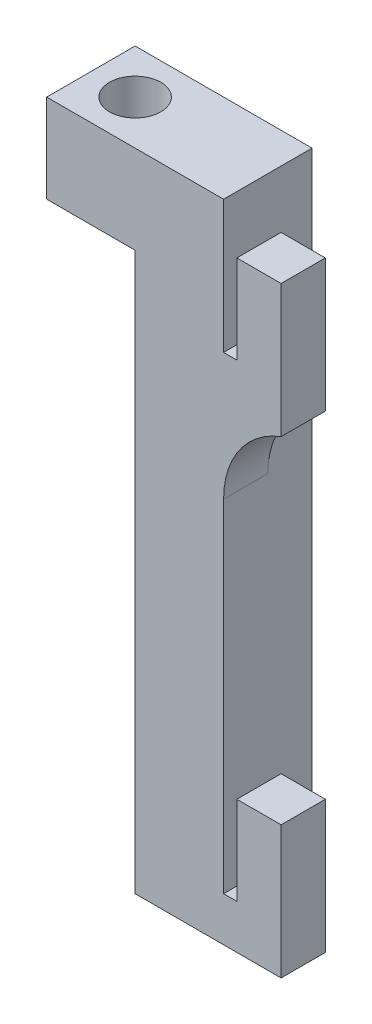
ISO-10303-21;
HEADER;
FILE_DESCRIPTION(('STEP AP214'),'2;1');
FILE_NAME('part.step','',(''),(''),'','','');
FILE_SCHEMA(('AUTOMOTIVE_DESIGN { 1 0 10303 214 1 1 1 1 }'));
ENDSEC;
DATA;
#1=APPLICATION_CONTEXT('core data for automotive mechanical design processes');
#2=APPLICATION_PROTOCOL_DEFINITION('international standard','automotive_design',2000,#1);
#3=PRODUCT_CONTEXT('',#1,'mechanical');
#4=PRODUCT('Part','Part','',(#3));
#5=PRODUCT_RELATED_PRODUCT_CATEGORY('part','',(#4));
#6=PRODUCT_DEFINITION_FORMATION('','',#4);
#7=PRODUCT_DEFINITION_CONTEXT('part definition',#1,'design');
#8=PRODUCT_DEFINITION('design','',#6,#7);
#9=PRODUCT_DEFINITION_SHAPE('','',#8);
#10=(LENGTH_UNIT() NAMED_UNIT(*) SI_UNIT(.MILLI.,.METRE.));
#11=(NAMED_UNIT(*) PLANE_ANGLE_UNIT() SI_UNIT($,.RADIAN.));
#12=(NAMED_UNIT(*) SI_UNIT($,.STERADIAN.) SOLID_ANGLE_UNIT());
#13=UNCERTAINTY_MEASURE_WITH_UNIT(LENGTH_MEASURE(1.E-05),#10,'distance_accuracy_value','');
#14=(GEOMETRIC_REPRESENTATION_CONTEXT(3) GLOBAL_UNCERTAINTY_ASSIGNED_CONTEXT((#13)) GLOBAL_UNIT_ASSIGNED_CONTEXT((#10,
#11,#12)) REPRESENTATION_CONTEXT('',''));
#15=CARTESIAN_POINT('',(0.,0.,0.));
#16=DIRECTION('',(0.,0.,1.));
#17=DIRECTION('',(1.,0.,0.));
#18=AXIS2_PLACEMENT_3D('',#15,#16,#17);
#19=CARTESIAN_POINT('',(0.,10.,-15.));
#20=DIRECTION('',(1.,0.,0.));
#21=DIRECTION('',(0.,1.,0.));
#22=AXIS2_PLACEMENT_3D('',#19,#20,#21);
#23=PLANE('',#22);
#24=DIRECTION('',(0.,-1.,0.));
#25=VECTOR('',#24,1.);
#26=CARTESIAN_POINT('',(0.,10.,-5.));
#27=LINE('',#26,#25);
#28=CARTESIAN_POINT('',(0.,10.,-5.));
#29=VERTEX_POINT('',#28);
#30=CARTESIAN_POINT('',(0.,0.,-5.));
#31=VERTEX_POINT('',#30);
#32=EDGE_CURVE('E219',#29,#31,#27,.T.);
#33=ORIENTED_EDGE('',*,*,#32,.F.);
#34=DIRECTION('',(0.,0.,1.));
#35=VECTOR('',#34,1.);
#36=CARTESIAN_POINT('',(0.,10.,-15.));
#37=LINE('',#36,#35);
#38=CARTESIAN_POINT('',(0.,10.,-15.));
#39=VERTEX_POINT('',#38);
#40=EDGE_CURVE('E218',#39,#29,#37,.T.);
#41=ORIENTED_EDGE('',*,*,#40,.F.);
#42=DIRECTION('',(0.,-1.,0.));
#43=VECTOR('',#42,1.);
#44=CARTESIAN_POINT('',(0.,10.,-15.));
#45=LINE('',#44,#43);
#46=CARTESIAN_POINT('',(0.,0.,-15.));
#47=VERTEX_POINT('',#46);
#48=EDGE_CURVE('E272',#39,#47,#45,.T.);
#49=ORIENTED_EDGE('',*,*,#48,.T.);
#50=DIRECTION('',(0.,0.,1.));
#51=VECTOR('',#50,1.);
#52=CARTESIAN_POINT('',(0.,0.,-15.));
#53=LINE('',#52,#51);
#54=EDGE_CURVE('E319',#47,#31,#53,.T.);
#55=ORIENTED_EDGE('',*,*,#54,.T.);
#56=EDGE_LOOP('',(#33,#41,#49,#55));
#57=FACE_BOUND('',#56,.T.);
#58=ADVANCED_FACE('F44',(#57),#23,.F.);
#59=CARTESIAN_POINT('',(0.,0.,-15.));
#60=DIRECTION('',(0.,1.,0.));
#61=DIRECTION('',(0.,0.,-1.));
#62=AXIS2_PLACEMENT_3D('',#59,#60,#61);
#63=PLANE('',#62);
#64=CARTESIAN_POINT('',(5.,0.,-10.));
#65=DIRECTION('',(0.,-1.,0.));
#66=DIRECTION('',(0.,0.,-1.));
#67=AXIS2_PLACEMENT_3D('',#64,#65,#66);
#68=CIRCLE('',#67,2.89999999999999);
#69=CARTESIAN_POINT('',(5.,0.,-12.9));
#70=VERTEX_POINT('',#69);
#71=EDGE_CURVE('E327',#70,#70,#68,.T.);
#72=ORIENTED_EDGE('',*,*,#71,.F.);
#73=EDGE_LOOP('',(#72));
#74=FACE_BOUND('',#73,.T.);
#75=DIRECTION('',(1.,0.,0.));
#76=VECTOR('',#75,1.);
#77=CARTESIAN_POINT('',(0.,0.,-5.));
#78=LINE('',#77,#76);
#79=CARTESIAN_POINT('',(10.,0.,-5.));
#80=VERTEX_POINT('',#79);
#81=EDGE_CURVE('E224',#31,#80,#78,.T.);
#82=ORIENTED_EDGE('',*,*,#81,.F.);
#83=ORIENTED_EDGE('',*,*,#54,.F.);
#84=DIRECTION('',(1.,0.,0.));
#85=VECTOR('',#84,1.);
#86=CARTESIAN_POINT('',(0.,0.,-15.));
#87=LINE('',#86,#85);
#88=CARTESIAN_POINT('',(10.,0.,-15.));
#89=VERTEX_POINT('',#88);
#90=EDGE_CURVE('E212',#47,#89,#87,.T.);
#91=ORIENTED_EDGE('',*,*,#90,.T.);
#92=DIRECTION('',(0.,0.,1.));
#93=VECTOR('',#92,1.);
#94=CARTESIAN_POINT('',(10.,0.,-15.));
#95=LINE('',#94,#93);
#96=EDGE_CURVE('E320',#89,#80,#95,.T.);
#97=ORIENTED_EDGE('',*,*,#96,.T.);
#98=EDGE_LOOP('',(#82,#83,#91,#97));
#99=FACE_BOUND('',#98,.T.);
#100=ADVANCED_FACE('F358',(#74,#99),#63,.F.);
#101=CARTESIAN_POINT('',(10.,0.,-15.));
#102=DIRECTION('',(1.,0.,0.));
#103=DIRECTION('',(0.,1.,0.));
#104=AXIS2_PLACEMENT_3D('',#101,#102,#103);
#105=PLANE('',#104);
#106=DIRECTION('',(0.,-1.,0.));
#107=VECTOR('',#106,1.);
#108=CARTESIAN_POINT('',(10.,0.,-5.));
#109=LINE('',#108,#107);
#110=CARTESIAN_POINT('',(10.,-63.,-5.));
#111=VERTEX_POINT('',#110);
#112=EDGE_CURVE('E230',#80,#111,#109,.T.);
#113=ORIENTED_EDGE('',*,*,#112,.F.);
#114=ORIENTED_EDGE('',*,*,#96,.F.);
#115=DIRECTION('',(0.,-1.,0.));
#116=VECTOR('',#115,1.);
#117=CARTESIAN_POINT('',(10.,0.,-15.));
#118=LINE('',#117,#116);
#119=CARTESIAN_POINT('',(10.,-63.,-15.));
#120=VERTEX_POINT('',#119);
#121=EDGE_CURVE('E209',#89,#120,#118,.T.);
#122=ORIENTED_EDGE('',*,*,#121,.T.);
#123=DIRECTION('',(0.,0.,1.));
#124=VECTOR('',#123,1.);
#125=CARTESIAN_POINT('',(10.,-63.,-15.));
#126=LINE('',#125,#124);
#127=EDGE_CURVE('E210',#120,#111,#126,.T.);
#128=ORIENTED_EDGE('',*,*,#127,.T.);
#129=EDGE_LOOP('',(#113,#114,#122,#128));
#130=FACE_BOUND('',#129,.T.);
#131=ADVANCED_FACE('F365',(#130),#105,.F.);
#132=CARTESIAN_POINT('',(10.,-63.,-15.));
#133=DIRECTION('',(0.,1.,0.));
#134=DIRECTION('',(0.,0.,-1.));
#135=AXIS2_PLACEMENT_3D('',#132,#133,#134);
#136=PLANE('',#135);
#137=DIRECTION('',(-1.,0.,0.));
#138=VECTOR('',#137,1.);
#139=CARTESIAN_POINT('',(20.,-63.,-10.));
#140=LINE('',#139,#138);
#141=CARTESIAN_POINT('',(26.5,-63.,-10.));
#142=VERTEX_POINT('',#141);
#143=CARTESIAN_POINT('',(20.,-63.,-10.));
#144=VERTEX_POINT('',#143);
#145=EDGE_CURVE('E205',#142,#144,#140,.T.);
#146=ORIENTED_EDGE('',*,*,#145,.F.);
#147=DIRECTION('',(0.,0.,1.));
#148=VECTOR('',#147,1.);
#149=CARTESIAN_POINT('',(26.5,-63.,-15.));
#150=LINE('',#149,#148);
#151=CARTESIAN_POINT('',(26.5,-63.,-5.));
#152=VERTEX_POINT('',#151);
#153=EDGE_CURVE('E315',#142,#152,#150,.T.);
#154=ORIENTED_EDGE('',*,*,#153,.T.);
#155=DIRECTION('',(1.,0.,0.));
#156=VECTOR('',#155,1.);
#157=CARTESIAN_POINT('',(10.,-63.,-5.));
#158=LINE('',#157,#156);
#159=EDGE_CURVE('E232',#111,#152,#158,.T.);
#160=ORIENTED_EDGE('',*,*,#159,.F.);
#161=ORIENTED_EDGE('',*,*,#127,.F.);
#162=DIRECTION('',(1.,0.,0.));
#163=VECTOR('',#162,1.);
#164=CARTESIAN_POINT('',(10.,-63.,-15.));
#165=LINE('',#164,#163);
#166=CARTESIAN_POINT('',(20.,-63.,-15.));
#167=VERTEX_POINT('',#166);
#168=EDGE_CURVE('E184',#120,#167,#165,.T.);
#169=ORIENTED_EDGE('',*,*,#168,.T.);
#170=DIRECTION('',(0.,0.,-1.));
#171=VECTOR('',#170,1.);
#172=CARTESIAN_POINT('',(20.,-63.,-15.));
#173=LINE('',#172,#171);
#174=EDGE_CURVE('E191',#144,#167,#173,.T.);
#175=ORIENTED_EDGE('',*,*,#174,.F.);
#176=EDGE_LOOP('',(#146,#154,#160,#161,#169,#175));
#177=FACE_BOUND('',#176,.T.);
#178=ADVANCED_FACE('F202',(#177),#136,.F.);
#179=CARTESIAN_POINT('',(26.5,-63.,-15.));
#180=DIRECTION('',(-1.,0.,0.));
#181=DIRECTION('',(0.,0.,-1.));
#182=AXIS2_PLACEMENT_3D('',#179,#180,#181);
#183=PLANE('',#182);
#184=DIRECTION('',(0.,0.,1.));
#185=VECTOR('',#184,1.);
#186=CARTESIAN_POINT('',(26.5,-48.,-15.));
#187=LINE('',#186,#185);
#188=CARTESIAN_POINT('',(26.5,-48.,-10.));
#189=VERTEX_POINT('',#188);
#190=CARTESIAN_POINT('',(26.5,-48.,-5.));
#191=VERTEX_POINT('',#190);
#192=EDGE_CURVE('E306',#189,#191,#187,.T.);
#193=ORIENTED_EDGE('',*,*,#192,.T.);
#194=DIRECTION('',(0.,1.,0.));
#195=VECTOR('',#194,1.);
#196=CARTESIAN_POINT('',(26.5,-63.,-5.));
#197=LINE('',#196,#195);
#198=EDGE_CURVE('E233',#152,#191,#197,.T.);
#199=ORIENTED_EDGE('',*,*,#198,.F.);
#200=ORIENTED_EDGE('',*,*,#153,.F.);
#201=DIRECTION('',(0.,1.,0.));
#202=VECTOR('',#201,1.);
#203=CARTESIAN_POINT('',(26.5,-63.,-10.));
#204=LINE('',#203,#202);
#205=EDGE_CURVE('E335',#142,#189,#204,.T.);
#206=ORIENTED_EDGE('',*,*,#205,.T.);
#207=EDGE_LOOP('',(#193,#199,#200,#206));
#208=FACE_BOUND('',#207,.T.);
#209=ADVANCED_FACE('F416',(#208),#183,.F.);
#210=CARTESIAN_POINT('',(26.5,-48.,-15.));
#211=DIRECTION('',(0.,-1.,0.));
#212=DIRECTION('',(0.,0.,1.));
#213=AXIS2_PLACEMENT_3D('',#210,#211,#212);
#214=PLANE('',#213);
#215=DIRECTION('',(0.,0.,1.));
#216=VECTOR('',#215,1.);
#217=CARTESIAN_POINT('',(21.5,-48.,-15.));
#218=LINE('',#217,#216);
#219=CARTESIAN_POINT('',(21.5,-48.,-10.));
#220=VERTEX_POINT('',#219);
#221=CARTESIAN_POINT('',(21.5,-48.,-5.));
#222=VERTEX_POINT('',#221);
#223=EDGE_CURVE('E301',#220,#222,#218,.T.);
#224=ORIENTED_EDGE('',*,*,#223,.T.);
#225=DIRECTION('',(-1.,0.,0.));
#226=VECTOR('',#225,1.);
#227=CARTESIAN_POINT('',(26.5,-48.,-5.));
#228=LINE('',#227,#226);
#229=EDGE_CURVE('E239',#191,#222,#228,.T.);
#230=ORIENTED_EDGE('',*,*,#229,.F.);
#231=ORIENTED_EDGE('',*,*,#192,.F.);
#232=DIRECTION('',(1.,0.,0.));
#233=VECTOR('',#232,1.);
#234=CARTESIAN_POINT('',(26.5,-48.,-10.));
#235=LINE('',#234,#233);
#236=EDGE_CURVE('E221',#220,#189,#235,.T.);
#237=ORIENTED_EDGE('',*,*,#236,.F.);
#238=EDGE_LOOP('',(#224,#230,#231,#237));
#239=FACE_BOUND('',#238,.T.);
#240=ADVANCED_FACE('F423',(#239),#214,.F.);
#241=CARTESIAN_POINT('',(21.5,-48.,-15.));
#242=DIRECTION('',(1.,0.,0.));
#243=DIRECTION('',(0.,1.,0.));
#244=AXIS2_PLACEMENT_3D('',#241,#242,#243);
#245=PLANE('',#244);
#246=DIRECTION('',(0.,0.,1.));
#247=VECTOR('',#246,1.);
#248=CARTESIAN_POINT('',(21.5,-58.,-15.));
#249=LINE('',#248,#247);
#250=CARTESIAN_POINT('',(21.5,-58.,-10.));
#251=VERTEX_POINT('',#250);
#252=CARTESIAN_POINT('',(21.5,-58.,-5.));
#253=VERTEX_POINT('',#252);
#254=EDGE_CURVE('E299',#251,#253,#249,.T.);
#255=ORIENTED_EDGE('',*,*,#254,.T.);
#256=DIRECTION('',(0.,-1.,0.));
#257=VECTOR('',#256,1.);
#258=CARTESIAN_POINT('',(21.5,-48.,-5.));
#259=LINE('',#258,#257);
#260=EDGE_CURVE('E241',#222,#253,#259,.T.);
#261=ORIENTED_EDGE('',*,*,#260,.F.);
#262=ORIENTED_EDGE('',*,*,#223,.F.);
#263=DIRECTION('',(0.,1.,0.));
#264=VECTOR('',#263,1.);
#265=CARTESIAN_POINT('',(21.5,-48.,-10.));
#266=LINE('',#265,#264);
#267=EDGE_CURVE('E353',#251,#220,#266,.T.);
#268=ORIENTED_EDGE('',*,*,#267,.F.);
#269=EDGE_LOOP('',(#255,#261,#262,#268));
#270=FACE_BOUND('',#269,.T.);
#271=ADVANCED_FACE('F422',(#270),#245,.F.);
#272=CARTESIAN_POINT('',(21.5,-58.,-15.));
#273=DIRECTION('',(0.,-1.,0.));
#274=DIRECTION('',(1.,0.,0.));
#275=AXIS2_PLACEMENT_3D('',#272,#273,#274);
#276=PLANE('',#275);
#277=DIRECTION('',(0.,0.,1.));
#278=VECTOR('',#277,1.);
#279=CARTESIAN_POINT('',(20.,-58.,-15.));
#280=LINE('',#279,#278);
#281=CARTESIAN_POINT('',(20.,-58.,-10.));
#282=VERTEX_POINT('',#281);
#283=CARTESIAN_POINT('',(20.,-58.,-5.));
#284=VERTEX_POINT('',#283);
#285=EDGE_CURVE('E298',#282,#284,#280,.T.);
#286=ORIENTED_EDGE('',*,*,#285,.T.);
#287=DIRECTION('',(-1.,0.,0.));
#288=VECTOR('',#287,1.);
#289=CARTESIAN_POINT('',(21.5,-58.,-5.));
#290=LINE('',#289,#288);
#291=EDGE_CURVE('E249',#253,#284,#290,.T.);
#292=ORIENTED_EDGE('',*,*,#291,.F.);
#293=ORIENTED_EDGE('',*,*,#254,.F.);
#294=DIRECTION('',(1.,0.,0.));
#295=VECTOR('',#294,1.);
#296=CARTESIAN_POINT('',(21.5,-58.,-10.));
#297=LINE('',#296,#295);
#298=EDGE_CURVE('E346',#282,#251,#297,.T.);
#299=ORIENTED_EDGE('',*,*,#298,.F.);
#300=EDGE_LOOP('',(#286,#292,#293,#299));
#301=FACE_BOUND('',#300,.T.);
#302=ADVANCED_FACE('F427',(#301),#276,.F.);
#303=CARTESIAN_POINT('',(26.5,-9.99999999999999,-15.));
#304=DIRECTION('',(-1.,0.,0.));
#305=DIRECTION('',(0.,-1.,0.));
#306=AXIS2_PLACEMENT_3D('',#303,#304,#305);
#307=PLANE('',#306);
#308=DIRECTION('',(0.,0.,1.));
#309=VECTOR('',#308,1.);
#310=CARTESIAN_POINT('',(26.5,5.00000000000001,-15.));
#311=LINE('',#310,#309);
#312=CARTESIAN_POINT('',(26.5,5.,-10.));
#313=VERTEX_POINT('',#312);
#314=CARTESIAN_POINT('',(26.5,5.00000000000001,-5.));
#315=VERTEX_POINT('',#314);
#316=EDGE_CURVE('E286',#313,#315,#311,.T.);
#317=ORIENTED_EDGE('',*,*,#316,.T.);
#318=DIRECTION('',(0.,1.,0.));
#319=VECTOR('',#318,1.);
#320=CARTESIAN_POINT('',(26.5,-9.99999999999999,-5.));
#321=LINE('',#320,#319);
#322=CARTESIAN_POINT('',(26.5,-9.99999999999999,-5.));
#323=VERTEX_POINT('',#322);
#324=EDGE_CURVE('E254',#323,#315,#321,.T.);
#325=ORIENTED_EDGE('',*,*,#324,.F.);
#326=DIRECTION('',(0.,0.,1.));
#327=VECTOR('',#326,1.);
#328=CARTESIAN_POINT('',(26.5,-9.99999999999999,-15.));
#329=LINE('',#328,#327);
#330=CARTESIAN_POINT('',(26.5,-9.99999999999999,-10.));
#331=VERTEX_POINT('',#330);
#332=EDGE_CURVE('E291',#331,#323,#329,.T.);
#333=ORIENTED_EDGE('',*,*,#332,.F.);
#334=EDGE_CURVE('E339',#331,#313,#204,.T.);
#335=ORIENTED_EDGE('',*,*,#334,.T.);
#336=EDGE_LOOP('',(#317,#325,#333,#335));
#337=FACE_BOUND('',#336,.T.);
#338=ADVANCED_FACE('F387',(#337),#307,.F.);
#339=CARTESIAN_POINT('',(26.5,5.00000000000001,-15.));
#340=DIRECTION('',(0.,-1.,0.));
#341=DIRECTION('',(1.,0.,0.));
#342=AXIS2_PLACEMENT_3D('',#339,#340,#341);
#343=PLANE('',#342);
#344=DIRECTION('',(0.,0.,1.));
#345=VECTOR('',#344,1.);
#346=CARTESIAN_POINT('',(21.5,5.00000000000001,-15.));
#347=LINE('',#346,#345);
#348=CARTESIAN_POINT('',(21.5,5.,-10.));
#349=VERTEX_POINT('',#348);
#350=CARTESIAN_POINT('',(21.5,5.00000000000001,-5.));
#351=VERTEX_POINT('',#350);
#352=EDGE_CURVE('E287',#349,#351,#347,.T.);
#353=ORIENTED_EDGE('',*,*,#352,.T.);
#354=DIRECTION('',(-1.,0.,0.));
#355=VECTOR('',#354,1.);
#356=CARTESIAN_POINT('',(26.5,5.00000000000001,-5.));
#357=LINE('',#356,#355);
#358=EDGE_CURVE('E259',#315,#351,#357,.T.);
#359=ORIENTED_EDGE('',*,*,#358,.F.);
#360=ORIENTED_EDGE('',*,*,#316,.F.);
#361=DIRECTION('',(-1.,0.,0.));
#362=VECTOR('',#361,1.);
#363=CARTESIAN_POINT('',(20.,5.,-10.));
#364=LINE('',#363,#362);
#365=EDGE_CURVE('E201',#313,#349,#364,.T.);
#366=ORIENTED_EDGE('',*,*,#365,.T.);
#367=EDGE_LOOP('',(#353,#359,#360,#366));
#368=FACE_BOUND('',#367,.T.);
#369=ADVANCED_FACE('F381',(#368),#343,.F.);
#370=CARTESIAN_POINT('',(21.5,5.00000000000001,-15.));
#371=DIRECTION('',(1.,0.,0.));
#372=DIRECTION('',(0.,0.,1.));
#373=AXIS2_PLACEMENT_3D('',#370,#371,#372);
#374=PLANE('',#373);
#375=DIRECTION('',(0.,0.,1.));
#376=VECTOR('',#375,1.);
#377=CARTESIAN_POINT('',(21.5,-4.99999999999999,-15.));
#378=LINE('',#377,#376);
#379=CARTESIAN_POINT('',(21.5,-4.99999999999999,-10.));
#380=VERTEX_POINT('',#379);
#381=CARTESIAN_POINT('',(21.5,-4.99999999999999,-5.));
#382=VERTEX_POINT('',#381);
#383=EDGE_CURVE('E285',#380,#382,#378,.T.);
#384=ORIENTED_EDGE('',*,*,#383,.T.);
#385=DIRECTION('',(0.,-1.,0.));
#386=VECTOR('',#385,1.);
#387=CARTESIAN_POINT('',(21.5,5.00000000000001,-5.));
#388=LINE('',#387,#386);
#389=EDGE_CURVE('E265',#351,#382,#388,.T.);
#390=ORIENTED_EDGE('',*,*,#389,.F.);
#391=ORIENTED_EDGE('',*,*,#352,.F.);
#392=DIRECTION('',(0.,1.,0.));
#393=VECTOR('',#392,1.);
#394=CARTESIAN_POINT('',(21.5,5.00000000000001,-10.));
#395=LINE('',#394,#393);
#396=EDGE_CURVE('E347',#380,#349,#395,.T.);
#397=ORIENTED_EDGE('',*,*,#396,.F.);
#398=EDGE_LOOP('',(#384,#390,#391,#397));
#399=FACE_BOUND('',#398,.T.);
#400=ADVANCED_FACE('F377',(#399),#374,.F.);
#401=CARTESIAN_POINT('',(21.5,-4.99999999999999,-15.));
#402=DIRECTION('',(0.,-1.,0.));
#403=DIRECTION('',(0.,0.,1.));
#404=AXIS2_PLACEMENT_3D('',#401,#402,#403);
#405=PLANE('',#404);
#406=DIRECTION('',(0.,0.,1.));
#407=VECTOR('',#406,1.);
#408=CARTESIAN_POINT('',(20.,-4.99999999999999,-15.));
#409=LINE('',#408,#407);
#410=CARTESIAN_POINT('',(20.,-4.99999999999999,-10.));
#411=VERTEX_POINT('',#410);
#412=CARTESIAN_POINT('',(20.,-4.99999999999999,-5.));
#413=VERTEX_POINT('',#412);
#414=EDGE_CURVE('E279',#411,#413,#409,.T.);
#415=ORIENTED_EDGE('',*,*,#414,.T.);
#416=DIRECTION('',(-1.,0.,0.));
#417=VECTOR('',#416,1.);
#418=CARTESIAN_POINT('',(21.5,-4.99999999999999,-5.));
#419=LINE('',#418,#417);
#420=EDGE_CURVE('E264',#382,#413,#419,.T.);
#421=ORIENTED_EDGE('',*,*,#420,.F.);
#422=ORIENTED_EDGE('',*,*,#383,.F.);
#423=DIRECTION('',(1.,0.,0.));
#424=VECTOR('',#423,1.);
#425=CARTESIAN_POINT('',(21.5,-4.99999999999999,-10.));
#426=LINE('',#425,#424);
#427=EDGE_CURVE('E340',#411,#380,#426,.T.);
#428=ORIENTED_EDGE('',*,*,#427,.F.);
#429=EDGE_LOOP('',(#415,#421,#422,#428));
#430=FACE_BOUND('',#429,.T.);
#431=ADVANCED_FACE('F372',(#430),#405,.F.);
#432=CARTESIAN_POINT('',(20.,-4.99999999999999,-15.));
#433=DIRECTION('',(-1.,0.,0.));
#434=DIRECTION('',(0.,-1.,0.));
#435=AXIS2_PLACEMENT_3D('',#432,#433,#434);
#436=PLANE('',#435);
#437=DIRECTION('',(0.,1.,0.));
#438=VECTOR('',#437,1.);
#439=CARTESIAN_POINT('',(20.,-58.,-5.));
#440=LINE('',#439,#438);
#441=CARTESIAN_POINT('',(20.,-19.3674969975976,-5.));
#442=VERTEX_POINT('',#441);
#443=EDGE_CURVE('E253',#284,#442,#440,.T.);
#444=ORIENTED_EDGE('',*,*,#443,.F.);
#445=ORIENTED_EDGE('',*,*,#285,.F.);
#446=DIRECTION('',(0.,1.,0.));
#447=VECTOR('',#446,1.);
#448=CARTESIAN_POINT('',(20.,-63.,-10.));
#449=LINE('',#448,#447);
#450=EDGE_CURVE('E197',#144,#282,#449,.T.);
#451=ORIENTED_EDGE('',*,*,#450,.F.);
#452=ORIENTED_EDGE('',*,*,#174,.T.);
#453=DIRECTION('',(0.,1.,0.));
#454=VECTOR('',#453,1.);
#455=CARTESIAN_POINT('',(20.,-58.,-15.));
#456=LINE('',#455,#454);
#457=CARTESIAN_POINT('',(20.,10.,-15.));
#458=VERTEX_POINT('',#457);
#459=EDGE_CURVE('E178',#167,#458,#456,.T.);
#460=ORIENTED_EDGE('',*,*,#459,.T.);
#461=DIRECTION('',(0.,0.,1.));
#462=VECTOR('',#461,1.);
#463=CARTESIAN_POINT('',(20.,10.,-15.));
#464=LINE('',#463,#462);
#465=CARTESIAN_POINT('',(20.,10.,-5.));
#466=VERTEX_POINT('',#465);
#467=EDGE_CURVE('E277',#458,#466,#464,.T.);
#468=ORIENTED_EDGE('',*,*,#467,.T.);
#469=DIRECTION('',(0.,1.,0.));
#470=VECTOR('',#469,1.);
#471=CARTESIAN_POINT('',(20.,-4.99999999999999,-5.));
#472=LINE('',#471,#470);
#473=EDGE_CURVE('E268',#413,#466,#472,.T.);
#474=ORIENTED_EDGE('',*,*,#473,.F.);
#475=ORIENTED_EDGE('',*,*,#414,.F.);
#476=CARTESIAN_POINT('',(20.,-19.3674969975976,-10.));
#477=VERTEX_POINT('',#476);
#478=EDGE_CURVE('E332',#477,#411,#449,.T.);
#479=ORIENTED_EDGE('',*,*,#478,.F.);
#480=DIRECTION('',(0.,0.,-1.));
#481=VECTOR('',#480,1.);
#482=CARTESIAN_POINT('',(20.,-19.3674969975976,-15.));
#483=LINE('',#482,#481);
#484=EDGE_CURVE('E323',#442,#477,#483,.T.);
#485=ORIENTED_EDGE('',*,*,#484,.F.);
#486=EDGE_LOOP('',(#444,#445,#451,#452,#460,#468,#474,#475,#479,#485));
#487=FACE_BOUND('',#486,.T.);
#488=ADVANCED_FACE('F193',(#487),#436,.F.);
#489=CARTESIAN_POINT('',(20.,10.,-15.));
#490=DIRECTION('',(0.,-1.,0.));
#491=DIRECTION('',(1.,0.,0.));
#492=AXIS2_PLACEMENT_3D('',#489,#490,#491);
#493=PLANE('',#492);
#494=CARTESIAN_POINT('',(5.,10.,-10.));
#495=DIRECTION('',(0.,-1.,0.));
#496=DIRECTION('',(0.,0.,-1.));
#497=AXIS2_PLACEMENT_3D('',#494,#495,#496);
#498=CIRCLE('',#497,2.89999999999999);
#499=CARTESIAN_POINT('',(5.,10.,-12.9));
#500=VERTEX_POINT('',#499);
#501=EDGE_CURVE('E392',#500,#500,#498,.T.);
#502=ORIENTED_EDGE('',*,*,#501,.T.);
#503=EDGE_LOOP('',(#502));
#504=FACE_BOUND('',#503,.T.);
#505=DIRECTION('',(-1.,0.,0.));
#506=VECTOR('',#505,1.);
#507=CARTESIAN_POINT('',(20.,10.,-5.));
#508=LINE('',#507,#506);
#509=EDGE_CURVE('E271',#466,#29,#508,.T.);
#510=ORIENTED_EDGE('',*,*,#509,.F.);
#511=ORIENTED_EDGE('',*,*,#467,.F.);
#512=DIRECTION('',(-1.,0.,0.));
#513=VECTOR('',#512,1.);
#514=CARTESIAN_POINT('',(20.,10.,-15.));
#515=LINE('',#514,#513);
#516=EDGE_CURVE('E190',#458,#39,#515,.T.);
#517=ORIENTED_EDGE('',*,*,#516,.T.);
#518=ORIENTED_EDGE('',*,*,#40,.T.);
#519=EDGE_LOOP('',(#510,#511,#517,#518));
#520=FACE_BOUND('',#519,.T.);
#521=ADVANCED_FACE('F367',(#504,#520),#493,.F.);
#522=CARTESIAN_POINT('',(0.,0.,-15.));
#523=DIRECTION('',(0.,0.,-1.));
#524=DIRECTION('',(1.,0.,0.));
#525=AXIS2_PLACEMENT_3D('',#522,#523,#524);
#526=PLANE('',#525);
#527=ORIENTED_EDGE('',*,*,#459,.F.);
#528=ORIENTED_EDGE('',*,*,#168,.F.);
#529=ORIENTED_EDGE('',*,*,#121,.F.);
#530=ORIENTED_EDGE('',*,*,#90,.F.);
#531=ORIENTED_EDGE('',*,*,#48,.F.);
#532=ORIENTED_EDGE('',*,*,#516,.F.);
#533=EDGE_LOOP('',(#527,#528,#529,#530,#531,#532));
#534=FACE_BOUND('',#533,.T.);
#535=ADVANCED_FACE('F185',(#534),#526,.T.);
#536=CARTESIAN_POINT('',(0.,0.,-5.));
#537=DIRECTION('',(0.,0.,-1.));
#538=DIRECTION('',(1.,0.,0.));
#539=AXIS2_PLACEMENT_3D('',#536,#537,#538);
#540=PLANE('',#539);
#541=ORIENTED_EDGE('',*,*,#32,.T.);
#542=ORIENTED_EDGE('',*,*,#81,.T.);
#543=ORIENTED_EDGE('',*,*,#112,.T.);
#544=ORIENTED_EDGE('',*,*,#159,.T.);
#545=ORIENTED_EDGE('',*,*,#198,.T.);
#546=ORIENTED_EDGE('',*,*,#229,.T.);
#547=ORIENTED_EDGE('',*,*,#260,.T.);
#548=ORIENTED_EDGE('',*,*,#291,.T.);
#549=ORIENTED_EDGE('',*,*,#443,.T.);
#550=CARTESIAN_POINT('',(30.,-19.3674969975976,-5.));
#551=DIRECTION('',(0.,0.,1.));
#552=DIRECTION('',(1.,0.,0.));
#553=AXIS2_PLACEMENT_3D('',#550,#551,#552);
#554=CIRCLE('',#553,10.);
#555=EDGE_CURVE('E53',#323,#442,#554,.T.);
#556=ORIENTED_EDGE('',*,*,#555,.F.);
#557=ORIENTED_EDGE('',*,*,#324,.T.);
#558=ORIENTED_EDGE('',*,*,#358,.T.);
#559=ORIENTED_EDGE('',*,*,#389,.T.);
#560=ORIENTED_EDGE('',*,*,#420,.T.);
#561=ORIENTED_EDGE('',*,*,#473,.T.);
#562=ORIENTED_EDGE('',*,*,#509,.T.);
#563=EDGE_LOOP('',(#541,#542,#543,#544,#545,#546,#547,#548,#549,#556,#557,#558,#559,#560,#561,#562));
#564=FACE_BOUND('',#563,.T.);
#565=ADVANCED_FACE('F368',(#564),#540,.F.);
#566=CARTESIAN_POINT('',(20.,-63.,-10.));
#567=DIRECTION('',(0.,0.,1.));
#568=DIRECTION('',(-1.,0.,0.));
#569=AXIS2_PLACEMENT_3D('',#566,#567,#568);
#570=PLANE('',#569);
#571=ORIENTED_EDGE('',*,*,#267,.T.);
#572=ORIENTED_EDGE('',*,*,#236,.T.);
#573=ORIENTED_EDGE('',*,*,#205,.F.);
#574=ORIENTED_EDGE('',*,*,#145,.T.);
#575=ORIENTED_EDGE('',*,*,#450,.T.);
#576=ORIENTED_EDGE('',*,*,#298,.T.);
#577=EDGE_LOOP('',(#571,#572,#573,#574,#575,#576));
#578=FACE_BOUND('',#577,.T.);
#579=ADVANCED_FACE('F446',(#578),#570,.F.);
#580=ORIENTED_EDGE('',*,*,#334,.F.);
#581=CARTESIAN_POINT('',(30.,-19.3674969975976,-10.));
#582=DIRECTION('',(0.,0.,-1.));
#583=DIRECTION('',(-1.,0.,0.));
#584=AXIS2_PLACEMENT_3D('',#581,#582,#583);
#585=CIRCLE('',#584,10.);
#586=EDGE_CURVE('E11',#477,#331,#585,.T.);
#587=ORIENTED_EDGE('',*,*,#586,.F.);
#588=ORIENTED_EDGE('',*,*,#478,.T.);
#589=ORIENTED_EDGE('',*,*,#427,.T.);
#590=ORIENTED_EDGE('',*,*,#396,.T.);
#591=ORIENTED_EDGE('',*,*,#365,.F.);
#592=EDGE_LOOP('',(#580,#587,#588,#589,#590,#591));
#593=FACE_BOUND('',#592,.T.);
#594=ADVANCED_FACE('F376',(#593),#570,.F.);
#595=CARTESIAN_POINT('',(30.,-19.3674969975976,-15.));
#596=DIRECTION('',(0.,0.,-1.));
#597=DIRECTION('',(1.,0.,0.));
#598=AXIS2_PLACEMENT_3D('',#595,#596,#597);
#599=CYLINDRICAL_SURFACE('',#598,10.);
#600=ORIENTED_EDGE('',*,*,#586,.T.);
#601=ORIENTED_EDGE('',*,*,#332,.T.);
#602=ORIENTED_EDGE('',*,*,#555,.T.);
#603=ORIENTED_EDGE('',*,*,#484,.T.);
#604=EDGE_LOOP('',(#600,#601,#602,#603));
#605=FACE_BOUND('',#604,.T.);
#606=ADVANCED_FACE('F50',(#605),#599,.F.);
#607=CARTESIAN_POINT('',(5.,10.,-10.));
#608=DIRECTION('',(0.,1.,0.));
#609=DIRECTION('',(0.,0.,-1.));
#610=AXIS2_PLACEMENT_3D('',#607,#608,#609);
#611=CYLINDRICAL_SURFACE('',#610,2.89999999999999);
#612=ORIENTED_EDGE('',*,*,#71,.T.);
#613=EDGE_LOOP('',(#612));
#614=FACE_BOUND('',#613,.T.);
#615=ORIENTED_EDGE('',*,*,#501,.F.);
#616=EDGE_LOOP('',(#615));
#617=FACE_BOUND('',#616,.T.);
#618=ADVANCED_FACE('F396',(#614,#617),#611,.F.);
#619=CLOSED_SHELL('',(#58,#100,#131,#178,#209,#240,#271,#302,#338,#369,#400,#431,#488,#521,#535,
#565,#579,#594,#606,#618));
#620=MANIFOLD_SOLID_BREP('B2',#619);
#621=ADVANCED_BREP_SHAPE_REPRESENTATION('',(#18,#620),#14);
#622=SHAPE_DEFINITION_REPRESENTATION(#9,#621);
ENDSEC;
END-ISO-10303-21;
